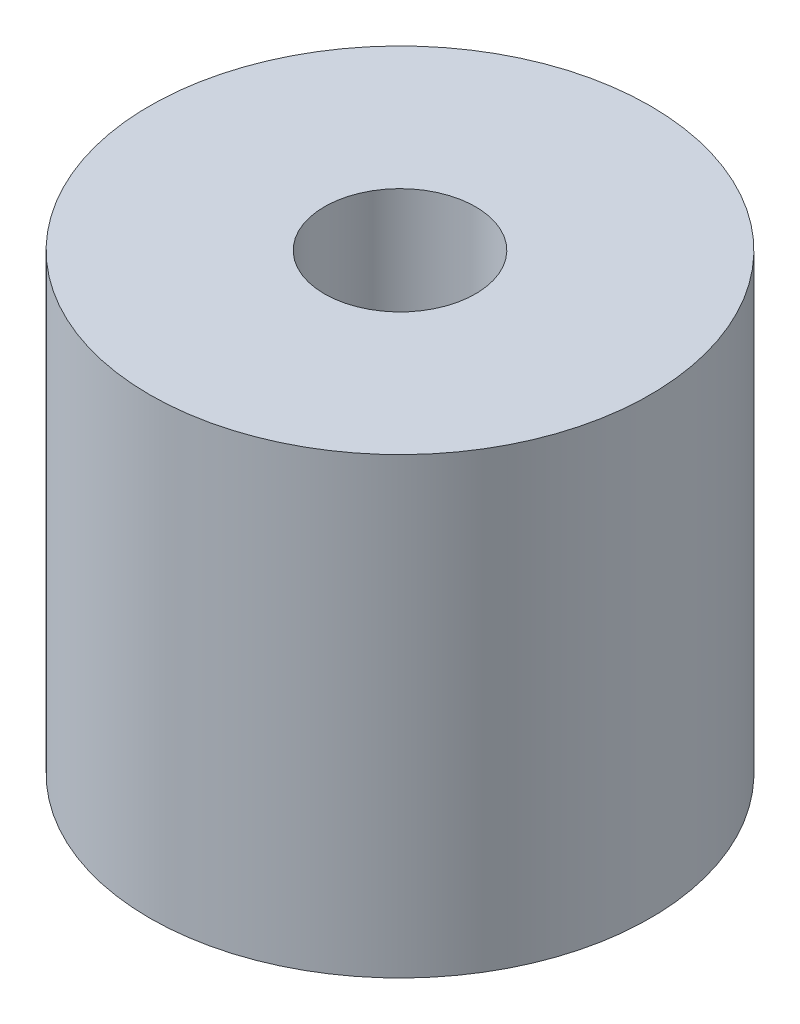
ISO-10303-21;
HEADER;
FILE_DESCRIPTION(('STEP AP214'),'2;1');
FILE_NAME('part.step','',(''),(''),'','','');
FILE_SCHEMA(('AUTOMOTIVE_DESIGN { 1 0 10303 214 1 1 1 1 }'));
ENDSEC;
DATA;
#1=APPLICATION_CONTEXT('core data for automotive mechanical design processes');
#2=APPLICATION_PROTOCOL_DEFINITION('international standard','automotive_design',2000,#1);
#3=PRODUCT_CONTEXT('',#1,'mechanical');
#4=PRODUCT('Part','Part','',(#3));
#5=PRODUCT_RELATED_PRODUCT_CATEGORY('part','',(#4));
#6=PRODUCT_DEFINITION_FORMATION('','',#4);
#7=PRODUCT_DEFINITION_CONTEXT('part definition',#1,'design');
#8=PRODUCT_DEFINITION('design','',#6,#7);
#9=PRODUCT_DEFINITION_SHAPE('','',#8);
#10=(LENGTH_UNIT() NAMED_UNIT(*) SI_UNIT(.MILLI.,.METRE.));
#11=(NAMED_UNIT(*) PLANE_ANGLE_UNIT() SI_UNIT($,.RADIAN.));
#12=(NAMED_UNIT(*) SI_UNIT($,.STERADIAN.) SOLID_ANGLE_UNIT());
#13=UNCERTAINTY_MEASURE_WITH_UNIT(LENGTH_MEASURE(1.E-05),#10,'distance_accuracy_value','');
#14=(GEOMETRIC_REPRESENTATION_CONTEXT(3) GLOBAL_UNCERTAINTY_ASSIGNED_CONTEXT((#13)) GLOBAL_UNIT_ASSIGNED_CONTEXT((#10,
#11,#12)) REPRESENTATION_CONTEXT('',''));
#15=CARTESIAN_POINT('',(0.,0.,0.));
#16=DIRECTION('',(0.,0.,1.));
#17=DIRECTION('',(1.,0.,0.));
#18=AXIS2_PLACEMENT_3D('',#15,#16,#17);
#19=CARTESIAN_POINT('',(0.,4.8,0.));
#20=DIRECTION('',(0.,-1.,0.));
#21=DIRECTION('',(0.,0.,-1.));
#22=AXIS2_PLACEMENT_3D('',#19,#20,#21);
#23=CYLINDRICAL_SURFACE('',#22,2.65);
#24=CARTESIAN_POINT('',(0.,4.8,0.));
#25=DIRECTION('',(0.,1.,0.));
#26=DIRECTION('',(0.,0.,1.));
#27=AXIS2_PLACEMENT_3D('',#24,#25,#26);
#28=CIRCLE('',#27,2.65);
#29=CARTESIAN_POINT('',(0.,4.8,2.65));
#30=VERTEX_POINT('',#29);
#31=EDGE_CURVE('E10',#30,#30,#28,.T.);
#32=ORIENTED_EDGE('',*,*,#31,.F.);
#33=EDGE_LOOP('',(#32));
#34=FACE_BOUND('',#33,.T.);
#35=CARTESIAN_POINT('',(0.,0.,0.));
#36=DIRECTION('',(0.,1.,0.));
#37=DIRECTION('',(0.,0.,1.));
#38=AXIS2_PLACEMENT_3D('',#35,#36,#37);
#39=CIRCLE('',#38,2.65);
#40=CARTESIAN_POINT('',(0.,0.,2.65));
#41=VERTEX_POINT('',#40);
#42=EDGE_CURVE('E36',#41,#41,#39,.T.);
#43=ORIENTED_EDGE('',*,*,#42,.T.);
#44=EDGE_LOOP('',(#43));
#45=FACE_BOUND('',#44,.T.);
#46=ADVANCED_FACE('F33',(#34,#45),#23,.T.);
#47=CARTESIAN_POINT('',(0.,4.8,0.));
#48=DIRECTION('',(0.,1.,0.));
#49=DIRECTION('',(0.,0.,1.));
#50=AXIS2_PLACEMENT_3D('',#47,#48,#49);
#51=PLANE('',#50);
#52=CARTESIAN_POINT('',(0.,4.8,0.));
#53=DIRECTION('',(0.,1.,0.));
#54=DIRECTION('',(0.,0.,1.));
#55=AXIS2_PLACEMENT_3D('',#52,#53,#54);
#56=CIRCLE('',#55,0.8);
#57=CARTESIAN_POINT('',(0.,4.8,0.8));
#58=VERTEX_POINT('',#57);
#59=EDGE_CURVE('E45',#58,#58,#56,.T.);
#60=ORIENTED_EDGE('',*,*,#59,.F.);
#61=EDGE_LOOP('',(#60));
#62=FACE_BOUND('',#61,.T.);
#63=ORIENTED_EDGE('',*,*,#31,.T.);
#64=EDGE_LOOP('',(#63));
#65=FACE_BOUND('',#64,.T.);
#66=ADVANCED_FACE('F60',(#62,#65),#51,.T.);
#67=CARTESIAN_POINT('',(0.,0.,0.));
#68=DIRECTION('',(0.,1.,0.));
#69=DIRECTION('',(0.,0.,1.));
#70=AXIS2_PLACEMENT_3D('',#67,#68,#69);
#71=PLANE('',#70);
#72=CARTESIAN_POINT('',(0.,0.,0.));
#73=DIRECTION('',(0.,1.,0.));
#74=DIRECTION('',(0.,0.,1.));
#75=AXIS2_PLACEMENT_3D('',#72,#73,#74);
#76=CIRCLE('',#75,0.8);
#77=CARTESIAN_POINT('',(0.,0.,0.8));
#78=VERTEX_POINT('',#77);
#79=EDGE_CURVE('E43',#78,#78,#76,.T.);
#80=ORIENTED_EDGE('',*,*,#79,.T.);
#81=EDGE_LOOP('',(#80));
#82=FACE_BOUND('',#81,.T.);
#83=ORIENTED_EDGE('',*,*,#42,.F.);
#84=EDGE_LOOP('',(#83));
#85=FACE_BOUND('',#84,.T.);
#86=ADVANCED_FACE('F51',(#82,#85),#71,.F.);
#87=CARTESIAN_POINT('',(0.,0.,0.));
#88=DIRECTION('',(0.,1.,0.));
#89=DIRECTION('',(0.,0.,1.));
#90=AXIS2_PLACEMENT_3D('',#87,#88,#89);
#91=CYLINDRICAL_SURFACE('',#90,0.8);
#92=ORIENTED_EDGE('',*,*,#79,.F.);
#93=EDGE_LOOP('',(#92));
#94=FACE_BOUND('',#93,.T.);
#95=ORIENTED_EDGE('',*,*,#59,.T.);
#96=EDGE_LOOP('',(#95));
#97=FACE_BOUND('',#96,.T.);
#98=ADVANCED_FACE('F54',(#94,#97),#91,.F.);
#99=CLOSED_SHELL('',(#46,#66,#86,#98));
#100=MANIFOLD_SOLID_BREP('B2',#99);
#101=ADVANCED_BREP_SHAPE_REPRESENTATION('',(#18,#100),#14);
#102=SHAPE_DEFINITION_REPRESENTATION(#9,#101);
ENDSEC;
END-ISO-10303-21;
